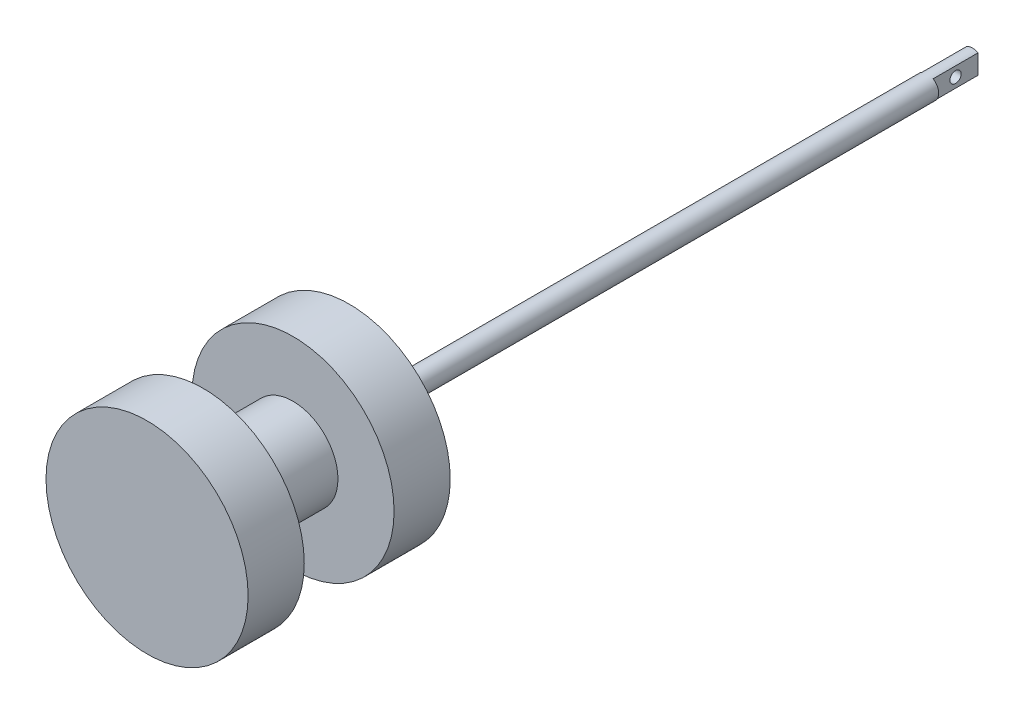
ISO-10303-21;
HEADER;
FILE_DESCRIPTION(('STEP AP214'),'2;1');
FILE_NAME('part.step','',(''),(''),'','','');
FILE_SCHEMA(('AUTOMOTIVE_DESIGN { 1 0 10303 214 1 1 1 1 }'));
ENDSEC;
DATA;
#1=APPLICATION_CONTEXT('core data for automotive mechanical design processes');
#2=APPLICATION_PROTOCOL_DEFINITION('international standard','automotive_design',2000,#1);
#3=PRODUCT_CONTEXT('',#1,'mechanical');
#4=PRODUCT('Part','Part','',(#3));
#5=PRODUCT_RELATED_PRODUCT_CATEGORY('part','',(#4));
#6=PRODUCT_DEFINITION_FORMATION('','',#4);
#7=PRODUCT_DEFINITION_CONTEXT('part definition',#1,'design');
#8=PRODUCT_DEFINITION('design','',#6,#7);
#9=PRODUCT_DEFINITION_SHAPE('','',#8);
#10=(LENGTH_UNIT() NAMED_UNIT(*) SI_UNIT(.MILLI.,.METRE.));
#11=(NAMED_UNIT(*) PLANE_ANGLE_UNIT() SI_UNIT($,.RADIAN.));
#12=(NAMED_UNIT(*) SI_UNIT($,.STERADIAN.) SOLID_ANGLE_UNIT());
#13=UNCERTAINTY_MEASURE_WITH_UNIT(LENGTH_MEASURE(1.E-05),#10,'distance_accuracy_value','');
#14=(GEOMETRIC_REPRESENTATION_CONTEXT(3) GLOBAL_UNCERTAINTY_ASSIGNED_CONTEXT((#13)) GLOBAL_UNIT_ASSIGNED_CONTEXT((#10,
#11,#12)) REPRESENTATION_CONTEXT('',''));
#15=CARTESIAN_POINT('',(0.,0.,0.));
#16=DIRECTION('',(0.,0.,1.));
#17=DIRECTION('',(1.,0.,0.));
#18=AXIS2_PLACEMENT_3D('',#15,#16,#17);
#19=CARTESIAN_POINT('',(0.,-225.,0.));
#20=DIRECTION('',(0.,0.,1.));
#21=DIRECTION('',(1.,0.,0.));
#22=AXIS2_PLACEMENT_3D('',#19,#20,#21);
#23=PLANE('',#22);
#24=CARTESIAN_POINT('',(0.,0.,0.));
#25=DIRECTION('',(0.,0.,1.));
#26=DIRECTION('',(1.,0.,0.));
#27=AXIS2_PLACEMENT_3D('',#24,#25,#26);
#28=CIRCLE('',#27,225.);
#29=CARTESIAN_POINT('',(225.,0.,0.));
#30=VERTEX_POINT('',#29);
#31=EDGE_CURVE('E126',#30,#30,#28,.T.);
#32=ORIENTED_EDGE('',*,*,#31,.T.);
#33=EDGE_LOOP('',(#32));
#34=FACE_BOUND('',#33,.T.);
#35=ADVANCED_FACE('F35',(#34),#23,.T.);
#36=CARTESIAN_POINT('',(0.,0.,-1837.5));
#37=DIRECTION('',(0.,0.,-1.));
#38=DIRECTION('',(-1.,0.,0.));
#39=AXIS2_PLACEMENT_3D('',#36,#37,#38);
#40=PLANE('',#39);
#41=DIRECTION('',(0.,-1.,0.));
#42=VECTOR('',#41,1.);
#43=CARTESIAN_POINT('',(-12.5,35.9782968451077,-1837.5));
#44=LINE('',#43,#42);
#45=CARTESIAN_POINT('',(-12.5,21.6506350946111,-1837.5));
#46=VERTEX_POINT('',#45);
#47=CARTESIAN_POINT('',(-12.5,-21.6506350946111,-1837.5));
#48=VERTEX_POINT('',#47);
#49=EDGE_CURVE('E75',#46,#48,#44,.T.);
#50=ORIENTED_EDGE('',*,*,#49,.F.);
#51=CARTESIAN_POINT('',(0.,0.,-1837.5));
#52=DIRECTION('',(0.,0.,1.));
#53=DIRECTION('',(1.,0.,0.));
#54=AXIS2_PLACEMENT_3D('',#51,#52,#53);
#55=CIRCLE('',#54,25.);
#56=CARTESIAN_POINT('',(12.5,21.6506350946111,-1837.5));
#57=VERTEX_POINT('',#56);
#58=EDGE_CURVE('E85',#57,#46,#55,.T.);
#59=ORIENTED_EDGE('',*,*,#58,.F.);
#60=DIRECTION('',(0.,1.,0.));
#61=VECTOR('',#60,1.);
#62=CARTESIAN_POINT('',(12.5,34.2994245104644,-1837.5));
#63=LINE('',#62,#61);
#64=CARTESIAN_POINT('',(12.5,-21.6506350946111,-1837.5));
#65=VERTEX_POINT('',#64);
#66=EDGE_CURVE('E133',#65,#57,#63,.T.);
#67=ORIENTED_EDGE('',*,*,#66,.F.);
#68=EDGE_CURVE('E86',#48,#65,#55,.T.);
#69=ORIENTED_EDGE('',*,*,#68,.F.);
#70=EDGE_LOOP('',(#50,#59,#67,#69));
#71=FACE_BOUND('',#70,.T.);
#72=ADVANCED_FACE('F83',(#71),#40,.T.);
#73=CARTESIAN_POINT('',(0.,0.,0.));
#74=DIRECTION('',(0.,0.,1.));
#75=DIRECTION('',(1.,0.,0.));
#76=AXIS2_PLACEMENT_3D('',#73,#74,#75);
#77=CYLINDRICAL_SURFACE('',#76,25.0000000000001);
#78=DIRECTION('',(0.,0.,1.));
#79=VECTOR('',#78,1.);
#80=CARTESIAN_POINT('',(-12.5,21.6506350946111,0.));
#81=LINE('',#80,#79);
#82=CARTESIAN_POINT('',(-12.5,21.6506350946111,-1737.5));
#83=VERTEX_POINT('',#82);
#84=EDGE_CURVE('E11',#83,#46,#81,.F.);
#85=ORIENTED_EDGE('',*,*,#84,.F.);
#86=CARTESIAN_POINT('',(0.,0.,-1737.5));
#87=DIRECTION('',(0.,0.,-1.));
#88=DIRECTION('',(-1.,0.,0.));
#89=AXIS2_PLACEMENT_3D('',#86,#87,#88);
#90=CIRCLE('',#89,25.0000000000001);
#91=CARTESIAN_POINT('',(-12.5,-21.6506350946111,-1737.5));
#92=VERTEX_POINT('',#91);
#93=EDGE_CURVE('E105',#83,#92,#90,.F.);
#94=ORIENTED_EDGE('',*,*,#93,.T.);
#95=DIRECTION('',(0.,0.,1.));
#96=VECTOR('',#95,1.);
#97=CARTESIAN_POINT('',(-12.5,-21.6506350946111,0.));
#98=LINE('',#97,#96);
#99=EDGE_CURVE('E42',#48,#92,#98,.T.);
#100=ORIENTED_EDGE('',*,*,#99,.F.);
#101=ORIENTED_EDGE('',*,*,#68,.T.);
#102=DIRECTION('',(0.,0.,1.));
#103=VECTOR('',#102,1.);
#104=CARTESIAN_POINT('',(12.5,-21.6506350946111,0.));
#105=LINE('',#104,#103);
#106=CARTESIAN_POINT('',(12.5,-21.6506350946111,-1737.5));
#107=VERTEX_POINT('',#106);
#108=EDGE_CURVE('E102',#107,#65,#105,.F.);
#109=ORIENTED_EDGE('',*,*,#108,.F.);
#110=CARTESIAN_POINT('',(0.,0.,-1737.5));
#111=DIRECTION('',(0.,0.,1.));
#112=DIRECTION('',(1.,0.,0.));
#113=AXIS2_PLACEMENT_3D('',#110,#111,#112);
#114=CIRCLE('',#113,25.0000000000001);
#115=CARTESIAN_POINT('',(12.5,21.6506350946111,-1737.5));
#116=VERTEX_POINT('',#115);
#117=EDGE_CURVE('E94',#116,#107,#114,.F.);
#118=ORIENTED_EDGE('',*,*,#117,.F.);
#119=DIRECTION('',(0.,0.,1.));
#120=VECTOR('',#119,1.);
#121=CARTESIAN_POINT('',(12.5,21.6506350946111,0.));
#122=LINE('',#121,#120);
#123=EDGE_CURVE('E93',#57,#116,#122,.T.);
#124=ORIENTED_EDGE('',*,*,#123,.F.);
#125=ORIENTED_EDGE('',*,*,#58,.T.);
#126=EDGE_LOOP('',(#85,#94,#100,#101,#109,#118,#124,#125));
#127=FACE_BOUND('',#126,.T.);
#128=CARTESIAN_POINT('',(0.,0.,-450.));
#129=DIRECTION('',(0.,0.,1.));
#130=DIRECTION('',(1.,0.,0.));
#131=AXIS2_PLACEMENT_3D('',#128,#129,#130);
#132=CIRCLE('',#131,25.0000000000002);
#133=CARTESIAN_POINT('',(25.0000000000002,0.,-450.));
#134=VERTEX_POINT('',#133);
#135=EDGE_CURVE('E97',#134,#134,#132,.T.);
#136=ORIENTED_EDGE('',*,*,#135,.F.);
#137=EDGE_LOOP('',(#136));
#138=FACE_BOUND('',#137,.T.);
#139=ADVANCED_FACE('F90',(#127,#138),#77,.T.);
#140=CARTESIAN_POINT('',(0.,-25.0000000000002,-450.));
#141=DIRECTION('',(0.,0.,-1.));
#142=DIRECTION('',(-1.,0.,0.));
#143=AXIS2_PLACEMENT_3D('',#140,#141,#142);
#144=PLANE('',#143);
#145=ORIENTED_EDGE('',*,*,#135,.T.);
#146=EDGE_LOOP('',(#145));
#147=FACE_BOUND('',#146,.T.);
#148=CARTESIAN_POINT('',(0.,0.,-450.));
#149=DIRECTION('',(0.,0.,1.));
#150=DIRECTION('',(1.,0.,0.));
#151=AXIS2_PLACEMENT_3D('',#148,#149,#150);
#152=CIRCLE('',#151,225.);
#153=CARTESIAN_POINT('',(225.,0.,-450.));
#154=VERTEX_POINT('',#153);
#155=EDGE_CURVE('E144',#154,#154,#152,.T.);
#156=ORIENTED_EDGE('',*,*,#155,.F.);
#157=EDGE_LOOP('',(#156));
#158=FACE_BOUND('',#157,.T.);
#159=ADVANCED_FACE('F151',(#147,#158),#144,.T.);
#160=CARTESIAN_POINT('',(0.,0.,0.));
#161=DIRECTION('',(0.,0.,1.));
#162=DIRECTION('',(1.,0.,0.));
#163=AXIS2_PLACEMENT_3D('',#160,#161,#162);
#164=CYLINDRICAL_SURFACE('',#163,225.);
#165=ORIENTED_EDGE('',*,*,#155,.T.);
#166=EDGE_LOOP('',(#165));
#167=FACE_BOUND('',#166,.T.);
#168=CARTESIAN_POINT('',(0.,0.,-325.));
#169=DIRECTION('',(0.,0.,1.));
#170=DIRECTION('',(1.,0.,0.));
#171=AXIS2_PLACEMENT_3D('',#168,#169,#170);
#172=CIRCLE('',#171,225.);
#173=CARTESIAN_POINT('',(225.,0.,-325.));
#174=VERTEX_POINT('',#173);
#175=EDGE_CURVE('E142',#174,#174,#172,.T.);
#176=ORIENTED_EDGE('',*,*,#175,.F.);
#177=EDGE_LOOP('',(#176));
#178=FACE_BOUND('',#177,.T.);
#179=ADVANCED_FACE('F158',(#167,#178),#164,.T.);
#180=CARTESIAN_POINT('',(0.,-225.,-325.));
#181=DIRECTION('',(0.,0.,1.));
#182=DIRECTION('',(1.,0.,0.));
#183=AXIS2_PLACEMENT_3D('',#180,#181,#182);
#184=PLANE('',#183);
#185=ORIENTED_EDGE('',*,*,#175,.T.);
#186=EDGE_LOOP('',(#185));
#187=FACE_BOUND('',#186,.T.);
#188=CARTESIAN_POINT('',(0.,0.,-325.));
#189=DIRECTION('',(0.,0.,1.));
#190=DIRECTION('',(1.,0.,0.));
#191=AXIS2_PLACEMENT_3D('',#188,#189,#190);
#192=CIRCLE('',#191,100.);
#193=CARTESIAN_POINT('',(100.,0.,-325.));
#194=VERTEX_POINT('',#193);
#195=EDGE_CURVE('E139',#194,#194,#192,.T.);
#196=ORIENTED_EDGE('',*,*,#195,.F.);
#197=EDGE_LOOP('',(#196));
#198=FACE_BOUND('',#197,.T.);
#199=ADVANCED_FACE('F163',(#187,#198),#184,.T.);
#200=CARTESIAN_POINT('',(0.,0.,0.));
#201=DIRECTION('',(0.,0.,1.));
#202=DIRECTION('',(1.,0.,0.));
#203=AXIS2_PLACEMENT_3D('',#200,#201,#202);
#204=CYLINDRICAL_SURFACE('',#203,100.);
#205=ORIENTED_EDGE('',*,*,#195,.T.);
#206=EDGE_LOOP('',(#205));
#207=FACE_BOUND('',#206,.T.);
#208=CARTESIAN_POINT('',(0.,0.,-125.));
#209=DIRECTION('',(0.,0.,1.));
#210=DIRECTION('',(1.,0.,0.));
#211=AXIS2_PLACEMENT_3D('',#208,#209,#210);
#212=CIRCLE('',#211,100.);
#213=CARTESIAN_POINT('',(100.,0.,-125.));
#214=VERTEX_POINT('',#213);
#215=EDGE_CURVE('E131',#214,#214,#212,.T.);
#216=ORIENTED_EDGE('',*,*,#215,.F.);
#217=EDGE_LOOP('',(#216));
#218=FACE_BOUND('',#217,.T.);
#219=ADVANCED_FACE('F166',(#207,#218),#204,.T.);
#220=CARTESIAN_POINT('',(0.,-100.,-125.));
#221=DIRECTION('',(0.,0.,-1.));
#222=DIRECTION('',(-1.,0.,0.));
#223=AXIS2_PLACEMENT_3D('',#220,#221,#222);
#224=PLANE('',#223);
#225=ORIENTED_EDGE('',*,*,#215,.T.);
#226=EDGE_LOOP('',(#225));
#227=FACE_BOUND('',#226,.T.);
#228=CARTESIAN_POINT('',(0.,0.,-125.));
#229=DIRECTION('',(0.,0.,1.));
#230=DIRECTION('',(1.,0.,0.));
#231=AXIS2_PLACEMENT_3D('',#228,#229,#230);
#232=CIRCLE('',#231,225.);
#233=CARTESIAN_POINT('',(225.,0.,-125.));
#234=VERTEX_POINT('',#233);
#235=EDGE_CURVE('E128',#234,#234,#232,.T.);
#236=ORIENTED_EDGE('',*,*,#235,.F.);
#237=EDGE_LOOP('',(#236));
#238=FACE_BOUND('',#237,.T.);
#239=ADVANCED_FACE('F170',(#227,#238),#224,.T.);
#240=CARTESIAN_POINT('',(0.,0.,0.));
#241=DIRECTION('',(0.,0.,1.));
#242=DIRECTION('',(1.,0.,0.));
#243=AXIS2_PLACEMENT_3D('',#240,#241,#242);
#244=CYLINDRICAL_SURFACE('',#243,225.);
#245=ORIENTED_EDGE('',*,*,#235,.T.);
#246=EDGE_LOOP('',(#245));
#247=FACE_BOUND('',#246,.T.);
#248=ORIENTED_EDGE('',*,*,#31,.F.);
#249=EDGE_LOOP('',(#248));
#250=FACE_BOUND('',#249,.T.);
#251=ADVANCED_FACE('F174',(#247,#250),#244,.T.);
#252=CARTESIAN_POINT('',(12.5,34.2994245104644,-1737.5));
#253=DIRECTION('',(-1.,0.,0.));
#254=DIRECTION('',(0.,0.,1.));
#255=AXIS2_PLACEMENT_3D('',#252,#253,#254);
#256=PLANE('',#255);
#257=CARTESIAN_POINT('',(12.5,0.,-1787.5));
#258=DIRECTION('',(1.,0.,0.));
#259=DIRECTION('',(0.,0.,-1.));
#260=AXIS2_PLACEMENT_3D('',#257,#258,#259);
#261=CIRCLE('',#260,12.5);
#262=CARTESIAN_POINT('',(12.5,0.,-1800.));
#263=VERTEX_POINT('',#262);
#264=EDGE_CURVE('E192',#263,#263,#261,.T.);
#265=ORIENTED_EDGE('',*,*,#264,.F.);
#266=EDGE_LOOP('',(#265));
#267=FACE_BOUND('',#266,.T.);
#268=ORIENTED_EDGE('',*,*,#108,.T.);
#269=ORIENTED_EDGE('',*,*,#66,.T.);
#270=ORIENTED_EDGE('',*,*,#123,.T.);
#271=DIRECTION('',(0.,1.,0.));
#272=VECTOR('',#271,1.);
#273=CARTESIAN_POINT('',(12.5,34.2994245104644,-1737.5));
#274=LINE('',#273,#272);
#275=EDGE_CURVE('E55',#107,#116,#274,.T.);
#276=ORIENTED_EDGE('',*,*,#275,.F.);
#277=EDGE_LOOP('',(#268,#269,#270,#276));
#278=FACE_BOUND('',#277,.T.);
#279=ADVANCED_FACE('F178',(#267,#278),#256,.F.);
#280=CARTESIAN_POINT('',(0.,0.,-1737.5));
#281=DIRECTION('',(0.,0.,1.));
#282=DIRECTION('',(1.,0.,0.));
#283=AXIS2_PLACEMENT_3D('',#280,#281,#282);
#284=PLANE('',#283);
#285=ORIENTED_EDGE('',*,*,#117,.T.);
#286=ORIENTED_EDGE('',*,*,#275,.T.);
#287=EDGE_LOOP('',(#285,#286));
#288=FACE_BOUND('',#287,.T.);
#289=ADVANCED_FACE('F116',(#288),#284,.F.);
#290=CARTESIAN_POINT('',(-12.5,35.9782968451077,-1737.5));
#291=DIRECTION('',(1.,0.,0.));
#292=DIRECTION('',(0.,0.,-1.));
#293=AXIS2_PLACEMENT_3D('',#290,#291,#292);
#294=PLANE('',#293);
#295=CARTESIAN_POINT('',(-12.5,0.,-1787.5));
#296=DIRECTION('',(1.,0.,0.));
#297=DIRECTION('',(0.,0.,-1.));
#298=AXIS2_PLACEMENT_3D('',#295,#296,#297);
#299=CIRCLE('',#298,12.5);
#300=CARTESIAN_POINT('',(-12.5,0.,-1800.));
#301=VERTEX_POINT('',#300);
#302=EDGE_CURVE('E87',#301,#301,#299,.F.);
#303=ORIENTED_EDGE('',*,*,#302,.F.);
#304=EDGE_LOOP('',(#303));
#305=FACE_BOUND('',#304,.T.);
#306=ORIENTED_EDGE('',*,*,#84,.T.);
#307=ORIENTED_EDGE('',*,*,#49,.T.);
#308=ORIENTED_EDGE('',*,*,#99,.T.);
#309=DIRECTION('',(0.,-1.,0.));
#310=VECTOR('',#309,1.);
#311=CARTESIAN_POINT('',(-12.5,35.9782968451077,-1737.5));
#312=LINE('',#311,#310);
#313=EDGE_CURVE('E48',#83,#92,#312,.T.);
#314=ORIENTED_EDGE('',*,*,#313,.F.);
#315=EDGE_LOOP('',(#306,#307,#308,#314));
#316=FACE_BOUND('',#315,.T.);
#317=ADVANCED_FACE('F74',(#305,#316),#294,.F.);
#318=CARTESIAN_POINT('',(0.,0.,-1737.5));
#319=DIRECTION('',(0.,0.,-1.));
#320=DIRECTION('',(-1.,0.,0.));
#321=AXIS2_PLACEMENT_3D('',#318,#319,#320);
#322=PLANE('',#321);
#323=ORIENTED_EDGE('',*,*,#313,.T.);
#324=ORIENTED_EDGE('',*,*,#93,.F.);
#325=EDGE_LOOP('',(#323,#324));
#326=FACE_BOUND('',#325,.T.);
#327=ADVANCED_FACE('F106',(#326),#322,.T.);
#328=CARTESIAN_POINT('',(-225.001,0.,-1787.5));
#329=DIRECTION('',(1.,0.,0.));
#330=DIRECTION('',(0.,0.,-1.));
#331=AXIS2_PLACEMENT_3D('',#328,#329,#330);
#332=CYLINDRICAL_SURFACE('',#331,12.5);
#333=CARTESIAN_POINT('',(12.5,0.,-1800.));
#334=CARTESIAN_POINT('',(12.2395833333333,0.,-1800.));
#335=CARTESIAN_POINT('',(11.9791666666667,0.,-1800.));
#336=CARTESIAN_POINT('',(11.4583333333333,0.,-1800.));
#337=CARTESIAN_POINT('',(11.1979166666667,0.,-1800.));
#338=CARTESIAN_POINT('',(10.6770833333333,0.,-1800.));
#339=CARTESIAN_POINT('',(10.4166666666667,0.,-1800.));
#340=CARTESIAN_POINT('',(9.89583333333334,0.,-1800.));
#341=CARTESIAN_POINT('',(9.63541666666668,0.,-1800.));
#342=CARTESIAN_POINT('',(9.11458333333335,0.,-1800.));
#343=CARTESIAN_POINT('',(8.85416666666668,0.,-1800.));
#344=CARTESIAN_POINT('',(8.33333333333334,0.,-1800.));
#345=CARTESIAN_POINT('',(8.07291666666667,0.,-1800.));
#346=CARTESIAN_POINT('',(7.55208333333334,0.,-1800.));
#347=CARTESIAN_POINT('',(7.29166666666668,0.,-1800.));
#348=CARTESIAN_POINT('',(6.77083333333335,0.,-1800.));
#349=CARTESIAN_POINT('',(6.51041666666668,0.,-1800.));
#350=CARTESIAN_POINT('',(5.98958333333334,0.,-1800.));
#351=CARTESIAN_POINT('',(5.72916666666666,0.,-1800.));
#352=CARTESIAN_POINT('',(5.20833333333333,0.,-1800.));
#353=CARTESIAN_POINT('',(4.94791666666667,0.,-1800.));
#354=CARTESIAN_POINT('',(4.42708333333334,0.,-1800.));
#355=CARTESIAN_POINT('',(4.16666666666667,0.,-1800.));
#356=CARTESIAN_POINT('',(3.64583333333333,0.,-1800.));
#357=CARTESIAN_POINT('',(3.38541666666666,0.,-1800.));
#358=CARTESIAN_POINT('',(2.86458333333333,0.,-1800.));
#359=CARTESIAN_POINT('',(2.60416666666667,0.,-1800.));
#360=CARTESIAN_POINT('',(2.08333333333334,0.,-1800.));
#361=CARTESIAN_POINT('',(1.82291666666666,0.,-1800.));
#362=CARTESIAN_POINT('',(1.30208333333333,0.,-1800.));
#363=CARTESIAN_POINT('',(1.04166666666667,0.,-1800.));
#364=CARTESIAN_POINT('',(0.520833333333341,0.,-1800.));
#365=CARTESIAN_POINT('',(0.26041666666667,0.,-1800.));
#366=CARTESIAN_POINT('',(-0.26041666666667,0.,-1800.));
#367=CARTESIAN_POINT('',(-0.520833333333341,0.,-1800.));
#368=CARTESIAN_POINT('',(-1.04166666666667,0.,-1800.));
#369=CARTESIAN_POINT('',(-1.30208333333333,0.,-1800.));
#370=CARTESIAN_POINT('',(-1.82291666666666,0.,-1800.));
#371=CARTESIAN_POINT('',(-2.08333333333334,0.,-1800.));
#372=CARTESIAN_POINT('',(-2.60416666666667,0.,-1800.));
#373=CARTESIAN_POINT('',(-2.86458333333333,0.,-1800.));
#374=CARTESIAN_POINT('',(-3.38541666666666,0.,-1800.));
#375=CARTESIAN_POINT('',(-3.64583333333333,0.,-1800.));
#376=CARTESIAN_POINT('',(-4.16666666666667,0.,-1800.));
#377=CARTESIAN_POINT('',(-4.42708333333334,0.,-1800.));
#378=CARTESIAN_POINT('',(-4.94791666666667,0.,-1800.));
#379=CARTESIAN_POINT('',(-5.20833333333333,0.,-1800.));
#380=CARTESIAN_POINT('',(-5.72916666666666,0.,-1800.));
#381=CARTESIAN_POINT('',(-5.98958333333334,0.,-1800.));
#382=CARTESIAN_POINT('',(-6.51041666666668,0.,-1800.));
#383=CARTESIAN_POINT('',(-6.77083333333335,0.,-1800.));
#384=CARTESIAN_POINT('',(-7.29166666666668,0.,-1800.));
#385=CARTESIAN_POINT('',(-7.55208333333334,0.,-1800.));
#386=CARTESIAN_POINT('',(-8.07291666666667,0.,-1800.));
#387=CARTESIAN_POINT('',(-8.33333333333334,0.,-1800.));
#388=CARTESIAN_POINT('',(-8.85416666666668,0.,-1800.));
#389=CARTESIAN_POINT('',(-9.11458333333335,0.,-1800.));
#390=CARTESIAN_POINT('',(-9.63541666666668,0.,-1800.));
#391=CARTESIAN_POINT('',(-9.89583333333334,0.,-1800.));
#392=CARTESIAN_POINT('',(-10.4166666666667,0.,-1800.));
#393=CARTESIAN_POINT('',(-10.6770833333333,0.,-1800.));
#394=CARTESIAN_POINT('',(-11.1979166666667,0.,-1800.));
#395=CARTESIAN_POINT('',(-11.4583333333333,0.,-1800.));
#396=CARTESIAN_POINT('',(-11.9791666666667,0.,-1800.));
#397=CARTESIAN_POINT('',(-12.2395833333333,0.,-1800.));
#398=CARTESIAN_POINT('',(-12.5,0.,-1800.));
#399=B_SPLINE_CURVE_WITH_KNOTS('',3,(#333,#334,#335,#336,#337,#338,#339,#340,#341,#342,#343,
#344,#345,#346,#347,#348,#349,#350,#351,#352,#353,#354,#355,#356,#357,#358,#359,#360,#361,#362,
#363,#364,#365,#366,#367,#368,#369,#370,#371,#372,#373,#374,#375,#376,#377,#378,#379,#380,#381,
#382,#383,#384,#385,#386,#387,#388,#389,#390,#391,#392,#393,#394,#395,#396,#397,#398),
.UNSPECIFIED.,.F.,.F.,(4,2,2,2,2,2,2,2,2,2,2,2,2,2,2,2,2,2,2,2,2,2,2,2,2,2,2,2,2,2,2,2,4),(0.,
0.781250000000011,1.56249999999999,2.34375000000001,3.12499999999999,3.90625,4.68750000000001,
5.46874999999999,6.25000000000001,7.03125000000002,7.8125,8.59375000000001,9.37500000000002,
10.15625,10.9375,11.71875,12.5,13.28125,14.0625,14.84375,15.625,16.40625,17.1875,17.96875,18.75,
19.53125,20.3125,21.09375,21.875,22.65625,23.4375,24.21875,25.),.UNSPECIFIED.);
#400=EDGE_CURVE('BSEAM108',#263,#301,#399,.T.);
#401=ORIENTED_EDGE('',*,*,#264,.T.);
#402=ORIENTED_EDGE('',*,*,#302,.T.);
#403=ORIENTED_EDGE('',*,*,#400,.T.);
#404=ORIENTED_EDGE('',*,*,#400,.F.);
#405=EDGE_LOOP('',(#401,#403,#402,#404));
#406=FACE_BOUND('',#405,.T.);
#407=ADVANCED_FACE('F108',(#406),#332,.F.);
#408=CLOSED_SHELL('',(#35,#72,#139,#159,#179,#199,#219,#239,#251,#279,#289,#317,#327,#407));
#409=MANIFOLD_SOLID_BREP('B2',#408);
#410=ADVANCED_BREP_SHAPE_REPRESENTATION('',(#18,#409),#14);
#411=SHAPE_DEFINITION_REPRESENTATION(#9,#410);
ENDSEC;
END-ISO-10303-21;
